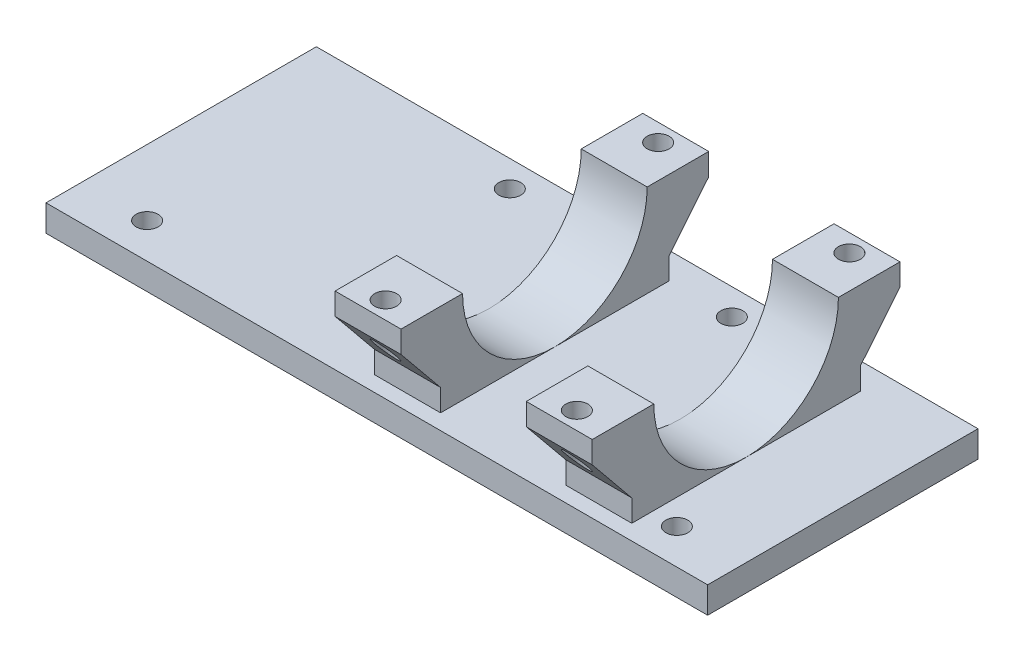
ISO-10303-21;
HEADER;
FILE_DESCRIPTION(('STEP AP214'),'2;1');
FILE_NAME('part.step','',(''),(''),'','','');
FILE_SCHEMA(('AUTOMOTIVE_DESIGN { 1 0 10303 214 1 1 1 1 }'));
ENDSEC;
DATA;
#1=APPLICATION_CONTEXT('core data for automotive mechanical design processes');
#2=APPLICATION_PROTOCOL_DEFINITION('international standard','automotive_design',2000,#1);
#3=PRODUCT_CONTEXT('',#1,'mechanical');
#4=PRODUCT('Part','Part','',(#3));
#5=PRODUCT_RELATED_PRODUCT_CATEGORY('part','',(#4));
#6=PRODUCT_DEFINITION_FORMATION('','',#4);
#7=PRODUCT_DEFINITION_CONTEXT('part definition',#1,'design');
#8=PRODUCT_DEFINITION('design','',#6,#7);
#9=PRODUCT_DEFINITION_SHAPE('','',#8);
#10=(LENGTH_UNIT() NAMED_UNIT(*) SI_UNIT(.MILLI.,.METRE.));
#11=(NAMED_UNIT(*) PLANE_ANGLE_UNIT() SI_UNIT($,.RADIAN.));
#12=(NAMED_UNIT(*) SI_UNIT($,.STERADIAN.) SOLID_ANGLE_UNIT());
#13=UNCERTAINTY_MEASURE_WITH_UNIT(LENGTH_MEASURE(1.E-05),#10,'distance_accuracy_value','');
#14=(GEOMETRIC_REPRESENTATION_CONTEXT(3) GLOBAL_UNCERTAINTY_ASSIGNED_CONTEXT((#13)) GLOBAL_UNIT_ASSIGNED_CONTEXT((#10,
#11,#12)) REPRESENTATION_CONTEXT('',''));
#15=CARTESIAN_POINT('',(0.,0.,0.));
#16=DIRECTION('',(0.,0.,1.));
#17=DIRECTION('',(1.,0.,0.));
#18=AXIS2_PLACEMENT_3D('',#15,#16,#17);
#19=CARTESIAN_POINT('',(36.5,6.,-26.));
#20=DIRECTION('',(0.,0.,-1.));
#21=DIRECTION('',(-1.,0.,0.));
#22=AXIS2_PLACEMENT_3D('',#19,#20,#21);
#23=PLANE('',#22);
#24=DIRECTION('',(1.,0.,0.));
#25=VECTOR('',#24,1.);
#26=CARTESIAN_POINT('',(72.25,6.,-26.));
#27=LINE('',#26,#25);
#28=CARTESIAN_POINT('',(-7.00000000000005,6.,-26.));
#29=VERTEX_POINT('',#28);
#30=CARTESIAN_POINT('',(7.99999999999995,6.,-26.));
#31=VERTEX_POINT('',#30);
#32=EDGE_CURVE('E249',#29,#31,#27,.T.);
#33=ORIENTED_EDGE('',*,*,#32,.F.);
#34=DIRECTION('',(0.,-1.,0.));
#35=VECTOR('',#34,1.);
#36=CARTESIAN_POINT('',(-7.00000000000004,6.,-26.));
#37=LINE('',#36,#35);
#38=CARTESIAN_POINT('',(-7.00000000000004,11.,-26.));
#39=VERTEX_POINT('',#38);
#40=EDGE_CURVE('E455',#39,#29,#37,.T.);
#41=ORIENTED_EDGE('',*,*,#40,.F.);
#42=DIRECTION('',(-1.,0.,0.));
#43=VECTOR('',#42,1.);
#44=CARTESIAN_POINT('',(7.99999999999996,11.,-26.));
#45=LINE('',#44,#43);
#46=CARTESIAN_POINT('',(7.99999999999995,11.,-26.));
#47=VERTEX_POINT('',#46);
#48=EDGE_CURVE('E64',#47,#39,#45,.T.);
#49=ORIENTED_EDGE('',*,*,#48,.F.);
#50=DIRECTION('',(0.,-1.,0.));
#51=VECTOR('',#50,1.);
#52=CARTESIAN_POINT('',(7.99999999999995,6.,-26.));
#53=LINE('',#52,#51);
#54=EDGE_CURVE('E451',#47,#31,#53,.T.);
#55=ORIENTED_EDGE('',*,*,#54,.T.);
#56=EDGE_LOOP('',(#33,#41,#49,#55));
#57=FACE_BOUND('',#56,.T.);
#58=ADVANCED_FACE('F44',(#57),#23,.T.);
#59=CARTESIAN_POINT('',(36.5,6.,-26.));
#60=VERTEX_POINT('',#59);
#61=CARTESIAN_POINT('',(51.5,6.,-26.));
#62=VERTEX_POINT('',#61);
#63=EDGE_CURVE('E252',#60,#62,#27,.T.);
#64=ORIENTED_EDGE('',*,*,#63,.F.);
#65=DIRECTION('',(0.,1.,0.));
#66=VECTOR('',#65,1.);
#67=CARTESIAN_POINT('',(36.5,6.,-26.));
#68=LINE('',#67,#66);
#69=CARTESIAN_POINT('',(36.5,11.,-26.));
#70=VERTEX_POINT('',#69);
#71=EDGE_CURVE('E487',#60,#70,#68,.T.);
#72=ORIENTED_EDGE('',*,*,#71,.T.);
#73=DIRECTION('',(1.,0.,0.));
#74=VECTOR('',#73,1.);
#75=CARTESIAN_POINT('',(36.5,11.,-26.));
#76=LINE('',#75,#74);
#77=CARTESIAN_POINT('',(51.5,11.,-26.));
#78=VERTEX_POINT('',#77);
#79=EDGE_CURVE('E316',#70,#78,#76,.T.);
#80=ORIENTED_EDGE('',*,*,#79,.T.);
#81=DIRECTION('',(0.,1.,0.));
#82=VECTOR('',#81,1.);
#83=CARTESIAN_POINT('',(51.5,6.,-26.));
#84=LINE('',#83,#82);
#85=EDGE_CURVE('E505',#62,#78,#84,.T.);
#86=ORIENTED_EDGE('',*,*,#85,.F.);
#87=EDGE_LOOP('',(#64,#72,#80,#86));
#88=FACE_BOUND('',#87,.T.);
#89=ADVANCED_FACE('F543',(#88),#23,.T.);
#90=CARTESIAN_POINT('',(36.5,6.,26.));
#91=DIRECTION('',(0.,0.,-1.));
#92=DIRECTION('',(-1.,0.,0.));
#93=AXIS2_PLACEMENT_3D('',#90,#91,#92);
#94=PLANE('',#93);
#95=DIRECTION('',(1.,0.,0.));
#96=VECTOR('',#95,1.);
#97=CARTESIAN_POINT('',(36.5,11.,26.));
#98=LINE('',#97,#96);
#99=CARTESIAN_POINT('',(36.5,11.,26.));
#100=VERTEX_POINT('',#99);
#101=CARTESIAN_POINT('',(51.5,11.,26.));
#102=VERTEX_POINT('',#101);
#103=EDGE_CURVE('E382',#100,#102,#98,.T.);
#104=ORIENTED_EDGE('',*,*,#103,.F.);
#105=DIRECTION('',(0.,1.,0.));
#106=VECTOR('',#105,1.);
#107=CARTESIAN_POINT('',(36.5,6.,26.));
#108=LINE('',#107,#106);
#109=CARTESIAN_POINT('',(36.5,6.,26.));
#110=VERTEX_POINT('',#109);
#111=EDGE_CURVE('E484',#110,#100,#108,.T.);
#112=ORIENTED_EDGE('',*,*,#111,.F.);
#113=DIRECTION('',(1.,0.,0.));
#114=VECTOR('',#113,1.);
#115=CARTESIAN_POINT('',(36.5,6.,26.));
#116=LINE('',#115,#114);
#117=CARTESIAN_POINT('',(51.5,6.,26.));
#118=VERTEX_POINT('',#117);
#119=EDGE_CURVE('E492',#110,#118,#116,.T.);
#120=ORIENTED_EDGE('',*,*,#119,.T.);
#121=DIRECTION('',(0.,1.,0.));
#122=VECTOR('',#121,1.);
#123=CARTESIAN_POINT('',(51.5,6.,26.));
#124=LINE('',#123,#122);
#125=EDGE_CURVE('E497',#118,#102,#124,.T.);
#126=ORIENTED_EDGE('',*,*,#125,.T.);
#127=EDGE_LOOP('',(#104,#112,#120,#126));
#128=FACE_BOUND('',#127,.T.);
#129=ADVANCED_FACE('F548',(#128),#94,.F.);
#130=CARTESIAN_POINT('',(36.5,27.,0.));
#131=DIRECTION('',(1.,0.,0.));
#132=DIRECTION('',(0.,0.,-1.));
#133=AXIS2_PLACEMENT_3D('',#130,#131,#132);
#134=PLANE('',#133);
#135=ORIENTED_EDGE('',*,*,#111,.T.);
#136=DIRECTION('',(0.,-0.773957299203321,-0.633237790257262));
#137=VECTOR('',#136,1.);
#138=CARTESIAN_POINT('',(36.5,22.,35.));
#139=LINE('',#138,#137);
#140=CARTESIAN_POINT('',(36.5,22.,35.));
#141=VERTEX_POINT('',#140);
#142=EDGE_CURVE('E368',#141,#100,#139,.T.);
#143=ORIENTED_EDGE('',*,*,#142,.F.);
#144=DIRECTION('',(0.,-1.,0.));
#145=VECTOR('',#144,1.);
#146=CARTESIAN_POINT('',(36.5,27.,35.));
#147=LINE('',#146,#145);
#148=CARTESIAN_POINT('',(36.5,27.,35.));
#149=VERTEX_POINT('',#148);
#150=EDGE_CURVE('E361',#149,#141,#147,.T.);
#151=ORIENTED_EDGE('',*,*,#150,.F.);
#152=DIRECTION('',(0.,0.,-1.));
#153=VECTOR('',#152,1.);
#154=CARTESIAN_POINT('',(36.5,27.,0.));
#155=LINE('',#154,#153);
#156=CARTESIAN_POINT('',(36.5,27.,21.));
#157=VERTEX_POINT('',#156);
#158=EDGE_CURVE('E392',#149,#157,#155,.T.);
#159=ORIENTED_EDGE('',*,*,#158,.T.);
#160=CARTESIAN_POINT('',(36.5,27.,0.));
#161=DIRECTION('',(1.,0.,0.));
#162=DIRECTION('',(0.,0.,-1.));
#163=AXIS2_PLACEMENT_3D('',#160,#161,#162);
#164=CIRCLE('',#163,21.);
#165=CARTESIAN_POINT('',(36.5,6.00000000000001,0.));
#166=VERTEX_POINT('',#165);
#167=EDGE_CURVE('E446',#157,#166,#164,.T.);
#168=ORIENTED_EDGE('',*,*,#167,.T.);
#169=DIRECTION('',(0.,0.,1.));
#170=VECTOR('',#169,1.);
#171=CARTESIAN_POINT('',(36.5,6.,-26.));
#172=LINE('',#171,#170);
#173=EDGE_CURVE('E488',#166,#110,#172,.T.);
#174=ORIENTED_EDGE('',*,*,#173,.T.);
#175=EDGE_LOOP('',(#135,#143,#151,#159,#168,#174));
#176=FACE_BOUND('',#175,.T.);
#177=ADVANCED_FACE('F558',(#176),#134,.F.);
#178=CARTESIAN_POINT('',(51.5,27.,0.));
#179=DIRECTION('',(1.,0.,0.));
#180=DIRECTION('',(0.,0.,-1.));
#181=AXIS2_PLACEMENT_3D('',#178,#179,#180);
#182=PLANE('',#181);
#183=DIRECTION('',(0.,0.,-1.));
#184=VECTOR('',#183,1.);
#185=CARTESIAN_POINT('',(51.5,27.,0.));
#186=LINE('',#185,#184);
#187=CARTESIAN_POINT('',(51.5,27.,35.));
#188=VERTEX_POINT('',#187);
#189=CARTESIAN_POINT('',(51.5,27.,21.));
#190=VERTEX_POINT('',#189);
#191=EDGE_CURVE('E383',#188,#190,#186,.T.);
#192=ORIENTED_EDGE('',*,*,#191,.F.);
#193=DIRECTION('',(0.,-1.,0.));
#194=VECTOR('',#193,1.);
#195=CARTESIAN_POINT('',(51.5,27.,35.));
#196=LINE('',#195,#194);
#197=CARTESIAN_POINT('',(51.5,22.,35.));
#198=VERTEX_POINT('',#197);
#199=EDGE_CURVE('E373',#188,#198,#196,.T.);
#200=ORIENTED_EDGE('',*,*,#199,.T.);
#201=DIRECTION('',(0.,-0.773957299203321,-0.633237790257262));
#202=VECTOR('',#201,1.);
#203=CARTESIAN_POINT('',(51.5,22.,35.));
#204=LINE('',#203,#202);
#205=EDGE_CURVE('E367',#198,#102,#204,.T.);
#206=ORIENTED_EDGE('',*,*,#205,.T.);
#207=ORIENTED_EDGE('',*,*,#125,.F.);
#208=DIRECTION('',(0.,0.,1.));
#209=VECTOR('',#208,1.);
#210=CARTESIAN_POINT('',(51.5,6.,-26.));
#211=LINE('',#210,#209);
#212=CARTESIAN_POINT('',(51.5,6.00000000000001,0.));
#213=VERTEX_POINT('',#212);
#214=EDGE_CURVE('E479',#213,#118,#211,.T.);
#215=ORIENTED_EDGE('',*,*,#214,.F.);
#216=CARTESIAN_POINT('',(51.5,27.,0.));
#217=DIRECTION('',(1.,0.,0.));
#218=DIRECTION('',(0.,0.,-1.));
#219=AXIS2_PLACEMENT_3D('',#216,#217,#218);
#220=CIRCLE('',#219,21.);
#221=EDGE_CURVE('E433',#190,#213,#220,.T.);
#222=ORIENTED_EDGE('',*,*,#221,.F.);
#223=EDGE_LOOP('',(#192,#200,#206,#207,#215,#222));
#224=FACE_BOUND('',#223,.T.);
#225=ADVANCED_FACE('F634',(#224),#182,.T.);
#226=CARTESIAN_POINT('',(-7.00000000000004,27.,0.));
#227=DIRECTION('',(-1.,0.,0.));
#228=DIRECTION('',(0.,0.,1.));
#229=AXIS2_PLACEMENT_3D('',#226,#227,#228);
#230=PLANE('',#229);
#231=DIRECTION('',(0.,0.,1.));
#232=VECTOR('',#231,1.);
#233=CARTESIAN_POINT('',(-7.00000000000004,27.,0.));
#234=LINE('',#233,#232);
#235=CARTESIAN_POINT('',(-7.00000000000004,27.,-35.));
#236=VERTEX_POINT('',#235);
#237=CARTESIAN_POINT('',(-7.00000000000005,27.,-21.));
#238=VERTEX_POINT('',#237);
#239=EDGE_CURVE('E415',#236,#238,#234,.T.);
#240=ORIENTED_EDGE('',*,*,#239,.F.);
#241=DIRECTION('',(0.,-1.,0.));
#242=VECTOR('',#241,1.);
#243=CARTESIAN_POINT('',(-7.00000000000004,27.,-35.));
#244=LINE('',#243,#242);
#245=CARTESIAN_POINT('',(-7.00000000000004,22.,-35.));
#246=VERTEX_POINT('',#245);
#247=EDGE_CURVE('E286',#236,#246,#244,.T.);
#248=ORIENTED_EDGE('',*,*,#247,.T.);
#249=DIRECTION('',(0.,-0.773957299203321,0.633237790257262));
#250=VECTOR('',#249,1.);
#251=CARTESIAN_POINT('',(-7.00000000000004,22.,-35.));
#252=LINE('',#251,#250);
#253=EDGE_CURVE('E281',#246,#39,#252,.T.);
#254=ORIENTED_EDGE('',*,*,#253,.T.);
#255=ORIENTED_EDGE('',*,*,#40,.T.);
#256=DIRECTION('',(0.,0.,1.));
#257=VECTOR('',#256,1.);
#258=CARTESIAN_POINT('',(-7.00000000000004,6.,-26.));
#259=LINE('',#258,#257);
#260=CARTESIAN_POINT('',(-7.00000000000005,6.00000000000001,0.));
#261=VERTEX_POINT('',#260);
#262=EDGE_CURVE('E456',#29,#261,#259,.T.);
#263=ORIENTED_EDGE('',*,*,#262,.T.);
#264=CARTESIAN_POINT('',(-7.00000000000005,27.,0.));
#265=DIRECTION('',(-1.,0.,0.));
#266=DIRECTION('',(0.,0.,1.));
#267=AXIS2_PLACEMENT_3D('',#264,#265,#266);
#268=CIRCLE('',#267,21.);
#269=EDGE_CURVE('E444',#238,#261,#268,.T.);
#270=ORIENTED_EDGE('',*,*,#269,.F.);
#271=EDGE_LOOP('',(#240,#248,#254,#255,#263,#270));
#272=FACE_BOUND('',#271,.T.);
#273=ADVANCED_FACE('F625',(#272),#230,.T.);
#274=CARTESIAN_POINT('',(7.99999999999995,27.,0.));
#275=DIRECTION('',(-1.,0.,0.));
#276=DIRECTION('',(0.,0.,1.));
#277=AXIS2_PLACEMENT_3D('',#274,#275,#276);
#278=PLANE('',#277);
#279=ORIENTED_EDGE('',*,*,#54,.F.);
#280=DIRECTION('',(0.,-0.773957299203321,0.633237790257262));
#281=VECTOR('',#280,1.);
#282=CARTESIAN_POINT('',(7.99999999999996,22.,-35.));
#283=LINE('',#282,#281);
#284=CARTESIAN_POINT('',(7.99999999999996,22.,-35.));
#285=VERTEX_POINT('',#284);
#286=EDGE_CURVE('E284',#285,#47,#283,.T.);
#287=ORIENTED_EDGE('',*,*,#286,.F.);
#288=DIRECTION('',(0.,-1.,0.));
#289=VECTOR('',#288,1.);
#290=CARTESIAN_POINT('',(7.99999999999996,27.,-35.));
#291=LINE('',#290,#289);
#292=CARTESIAN_POINT('',(7.99999999999996,27.,-35.));
#293=VERTEX_POINT('',#292);
#294=EDGE_CURVE('E278',#293,#285,#291,.T.);
#295=ORIENTED_EDGE('',*,*,#294,.F.);
#296=DIRECTION('',(0.,0.,1.));
#297=VECTOR('',#296,1.);
#298=CARTESIAN_POINT('',(7.99999999999995,27.,0.));
#299=LINE('',#298,#297);
#300=CARTESIAN_POINT('',(7.99999999999995,27.,-21.));
#301=VERTEX_POINT('',#300);
#302=EDGE_CURVE('E406',#293,#301,#299,.T.);
#303=ORIENTED_EDGE('',*,*,#302,.T.);
#304=CARTESIAN_POINT('',(7.99999999999995,27.,0.));
#305=DIRECTION('',(-1.,0.,0.));
#306=DIRECTION('',(0.,0.,1.));
#307=AXIS2_PLACEMENT_3D('',#304,#305,#306);
#308=CIRCLE('',#307,21.);
#309=CARTESIAN_POINT('',(7.99999999999995,6.00000000000001,0.));
#310=VERTEX_POINT('',#309);
#311=EDGE_CURVE('E438',#301,#310,#308,.T.);
#312=ORIENTED_EDGE('',*,*,#311,.T.);
#313=DIRECTION('',(0.,0.,1.));
#314=VECTOR('',#313,1.);
#315=CARTESIAN_POINT('',(7.99999999999995,6.,-26.));
#316=LINE('',#315,#314);
#317=EDGE_CURVE('E469',#31,#310,#316,.T.);
#318=ORIENTED_EDGE('',*,*,#317,.F.);
#319=EDGE_LOOP('',(#279,#287,#295,#303,#312,#318));
#320=FACE_BOUND('',#319,.T.);
#321=ADVANCED_FACE('F567',(#320),#278,.F.);
#322=CARTESIAN_POINT('',(0.,0.,29.5));
#323=DIRECTION('',(0.,0.,1.));
#324=DIRECTION('',(1.,0.,0.));
#325=AXIS2_PLACEMENT_3D('',#322,#323,#324);
#326=PLANE('',#325);
#327=DIRECTION('',(1.,0.,0.));
#328=VECTOR('',#327,1.);
#329=CARTESIAN_POINT('',(-74.5,0.,29.5));
#330=LINE('',#329,#328);
#331=CARTESIAN_POINT('',(-78.25,0.,29.5));
#332=VERTEX_POINT('',#331);
#333=CARTESIAN_POINT('',(72.25,0.,29.5));
#334=VERTEX_POINT('',#333);
#335=EDGE_CURVE('E428',#332,#334,#330,.T.);
#336=ORIENTED_EDGE('',*,*,#335,.T.);
#337=DIRECTION('',(0.,1.,0.));
#338=VECTOR('',#337,1.);
#339=CARTESIAN_POINT('',(72.25,0.,29.5));
#340=LINE('',#339,#338);
#341=CARTESIAN_POINT('',(72.25,6.,29.5));
#342=VERTEX_POINT('',#341);
#343=EDGE_CURVE('E227',#334,#342,#340,.T.);
#344=ORIENTED_EDGE('',*,*,#343,.T.);
#345=DIRECTION('',(-1.,0.,0.));
#346=VECTOR('',#345,1.);
#347=CARTESIAN_POINT('',(74.5,6.,29.5));
#348=LINE('',#347,#346);
#349=CARTESIAN_POINT('',(-78.25,6.,29.5));
#350=VERTEX_POINT('',#349);
#351=EDGE_CURVE('E435',#342,#350,#348,.T.);
#352=ORIENTED_EDGE('',*,*,#351,.T.);
#353=DIRECTION('',(0.,1.,0.));
#354=VECTOR('',#353,1.);
#355=CARTESIAN_POINT('',(-78.25,0.,29.5));
#356=LINE('',#355,#354);
#357=EDGE_CURVE('E418',#332,#350,#356,.T.);
#358=ORIENTED_EDGE('',*,*,#357,.F.);
#359=EDGE_LOOP('',(#336,#344,#352,#358));
#360=FACE_BOUND('',#359,.T.);
#361=ADVANCED_FACE('F559',(#360),#326,.T.);
#362=CARTESIAN_POINT('',(0.,6.,0.));
#363=DIRECTION('',(0.,1.,0.));
#364=DIRECTION('',(0.,0.,1.));
#365=AXIS2_PLACEMENT_3D('',#362,#363,#364);
#366=PLANE('',#365);
#367=CARTESIAN_POINT('',(-28.25,6.,-26.));
#368=DIRECTION('',(0.,-1.,0.));
#369=DIRECTION('',(0.,0.,1.));
#370=AXIS2_PLACEMENT_3D('',#367,#368,#369);
#371=CIRCLE('',#370,2.5);
#372=CARTESIAN_POINT('',(-28.25,6.,-23.5));
#373=VERTEX_POINT('',#372);
#374=EDGE_CURVE('E574',#373,#373,#371,.T.);
#375=ORIENTED_EDGE('',*,*,#374,.T.);
#376=EDGE_LOOP('',(#375));
#377=FACE_BOUND('',#376,.T.);
#378=CARTESIAN_POINT('',(22.25,6.,-26.));
#379=DIRECTION('',(0.,1.,0.));
#380=DIRECTION('',(0.,0.,1.));
#381=AXIS2_PLACEMENT_3D('',#378,#379,#380);
#382=CIRCLE('',#381,2.5);
#383=CARTESIAN_POINT('',(22.25,6.,-23.5));
#384=VERTEX_POINT('',#383);
#385=EDGE_CURVE('E578',#384,#384,#382,.T.);
#386=ORIENTED_EDGE('',*,*,#385,.F.);
#387=EDGE_LOOP('',(#386));
#388=FACE_BOUND('',#387,.T.);
#389=CARTESIAN_POINT('',(57.25,6.,21.5));
#390=DIRECTION('',(0.,-1.,0.));
#391=DIRECTION('',(0.,0.,1.));
#392=AXIS2_PLACEMENT_3D('',#389,#390,#391);
#393=CIRCLE('',#392,2.50000000000001);
#394=CARTESIAN_POINT('',(57.25,6.,24.));
#395=VERTEX_POINT('',#394);
#396=EDGE_CURVE('E257',#395,#395,#393,.T.);
#397=ORIENTED_EDGE('',*,*,#396,.T.);
#398=EDGE_LOOP('',(#397));
#399=FACE_BOUND('',#398,.T.);
#400=ORIENTED_EDGE('',*,*,#262,.F.);
#401=ORIENTED_EDGE('',*,*,#32,.T.);
#402=ORIENTED_EDGE('',*,*,#317,.T.);
#403=CARTESIAN_POINT('',(7.99999999999995,6.,26.));
#404=VERTEX_POINT('',#403);
#405=EDGE_CURVE('E467',#310,#404,#316,.T.);
#406=ORIENTED_EDGE('',*,*,#405,.T.);
#407=DIRECTION('',(1.,0.,0.));
#408=VECTOR('',#407,1.);
#409=CARTESIAN_POINT('',(-7.00000000000004,6.,26.));
#410=LINE('',#409,#408);
#411=CARTESIAN_POINT('',(-7.00000000000004,6.,26.));
#412=VERTEX_POINT('',#411);
#413=EDGE_CURVE('E466',#412,#404,#410,.T.);
#414=ORIENTED_EDGE('',*,*,#413,.F.);
#415=EDGE_CURVE('E457',#261,#412,#259,.T.);
#416=ORIENTED_EDGE('',*,*,#415,.F.);
#417=EDGE_LOOP('',(#400,#401,#402,#406,#414,#416));
#418=FACE_BOUND('',#417,.T.);
#419=EDGE_CURVE('E483',#60,#166,#172,.T.);
#420=ORIENTED_EDGE('',*,*,#419,.F.);
#421=ORIENTED_EDGE('',*,*,#63,.T.);
#422=EDGE_CURVE('E494',#62,#213,#211,.T.);
#423=ORIENTED_EDGE('',*,*,#422,.T.);
#424=ORIENTED_EDGE('',*,*,#214,.T.);
#425=ORIENTED_EDGE('',*,*,#119,.F.);
#426=ORIENTED_EDGE('',*,*,#173,.F.);
#427=EDGE_LOOP('',(#420,#421,#423,#424,#425,#426));
#428=FACE_BOUND('',#427,.T.);
#429=CARTESIAN_POINT('',(-63.25,6.,21.5));
#430=DIRECTION('',(0.,1.,0.));
#431=DIRECTION('',(0.,0.,1.));
#432=AXIS2_PLACEMENT_3D('',#429,#430,#431);
#433=CIRCLE('',#432,2.50000000000001);
#434=CARTESIAN_POINT('',(-63.25,6.,24.));
#435=VERTEX_POINT('',#434);
#436=EDGE_CURVE('E261',#435,#435,#433,.T.);
#437=ORIENTED_EDGE('',*,*,#436,.F.);
#438=EDGE_LOOP('',(#437));
#439=FACE_BOUND('',#438,.T.);
#440=DIRECTION('',(1.,0.,0.));
#441=VECTOR('',#440,1.);
#442=CARTESIAN_POINT('',(72.25,6.,-32.));
#443=LINE('',#442,#441);
#444=CARTESIAN_POINT('',(-78.25,6.,-32.));
#445=VERTEX_POINT('',#444);
#446=CARTESIAN_POINT('',(72.25,6.,-32.));
#447=VERTEX_POINT('',#446);
#448=EDGE_CURVE('E247',#445,#447,#443,.T.);
#449=ORIENTED_EDGE('',*,*,#448,.F.);
#450=DIRECTION('',(0.,0.,-1.));
#451=VECTOR('',#450,1.);
#452=CARTESIAN_POINT('',(-78.25,6.,29.5));
#453=LINE('',#452,#451);
#454=EDGE_CURVE('E425',#350,#445,#453,.T.);
#455=ORIENTED_EDGE('',*,*,#454,.F.);
#456=ORIENTED_EDGE('',*,*,#351,.F.);
#457=DIRECTION('',(0.,0.,1.));
#458=VECTOR('',#457,1.);
#459=CARTESIAN_POINT('',(72.25,6.,-26.5));
#460=LINE('',#459,#458);
#461=EDGE_CURVE('E234',#447,#342,#460,.T.);
#462=ORIENTED_EDGE('',*,*,#461,.F.);
#463=EDGE_LOOP('',(#449,#455,#456,#462));
#464=FACE_BOUND('',#463,.T.);
#465=ADVANCED_FACE('F556',(#377,#388,#399,#418,#428,#439,#464),#366,.T.);
#466=CARTESIAN_POINT('',(0.,0.,0.));
#467=DIRECTION('',(0.,1.,0.));
#468=DIRECTION('',(0.,0.,1.));
#469=AXIS2_PLACEMENT_3D('',#466,#467,#468);
#470=PLANE('',#469);
#471=CARTESIAN_POINT('',(-28.25,0.,-26.));
#472=DIRECTION('',(0.,-1.,0.));
#473=DIRECTION('',(0.,0.,1.));
#474=AXIS2_PLACEMENT_3D('',#471,#472,#473);
#475=CIRCLE('',#474,2.5);
#476=CARTESIAN_POINT('',(-28.25,0.,-23.5));
#477=VERTEX_POINT('',#476);
#478=EDGE_CURVE('E992',#477,#477,#475,.T.);
#479=ORIENTED_EDGE('',*,*,#478,.F.);
#480=EDGE_LOOP('',(#479));
#481=FACE_BOUND('',#480,.T.);
#482=CARTESIAN_POINT('',(22.25,0.,-26.));
#483=DIRECTION('',(0.,1.,0.));
#484=DIRECTION('',(0.,0.,1.));
#485=AXIS2_PLACEMENT_3D('',#482,#483,#484);
#486=CIRCLE('',#485,2.5);
#487=CARTESIAN_POINT('',(22.25,0.,-23.5));
#488=VERTEX_POINT('',#487);
#489=EDGE_CURVE('E999',#488,#488,#486,.T.);
#490=ORIENTED_EDGE('',*,*,#489,.T.);
#491=EDGE_LOOP('',(#490));
#492=FACE_BOUND('',#491,.T.);
#493=CARTESIAN_POINT('',(57.25,0.,21.5));
#494=DIRECTION('',(0.,-1.,0.));
#495=DIRECTION('',(0.,0.,1.));
#496=AXIS2_PLACEMENT_3D('',#493,#494,#495);
#497=CIRCLE('',#496,2.50000000000001);
#498=CARTESIAN_POINT('',(57.25,0.,24.));
#499=VERTEX_POINT('',#498);
#500=EDGE_CURVE('E270',#499,#499,#497,.T.);
#501=ORIENTED_EDGE('',*,*,#500,.F.);
#502=EDGE_LOOP('',(#501));
#503=FACE_BOUND('',#502,.T.);
#504=CARTESIAN_POINT('',(-63.25,0.,21.5));
#505=DIRECTION('',(0.,1.,0.));
#506=DIRECTION('',(0.,0.,1.));
#507=AXIS2_PLACEMENT_3D('',#504,#505,#506);
#508=CIRCLE('',#507,2.50000000000001);
#509=CARTESIAN_POINT('',(-63.25,0.,24.));
#510=VERTEX_POINT('',#509);
#511=EDGE_CURVE('E268',#510,#510,#508,.T.);
#512=ORIENTED_EDGE('',*,*,#511,.T.);
#513=EDGE_LOOP('',(#512));
#514=FACE_BOUND('',#513,.T.);
#515=DIRECTION('',(0.,0.,1.));
#516=VECTOR('',#515,1.);
#517=CARTESIAN_POINT('',(-78.25,0.,-26.5));
#518=LINE('',#517,#516);
#519=CARTESIAN_POINT('',(-78.25,0.,-32.));
#520=VERTEX_POINT('',#519);
#521=EDGE_CURVE('E239',#520,#332,#518,.T.);
#522=ORIENTED_EDGE('',*,*,#521,.F.);
#523=DIRECTION('',(-1.,0.,0.));
#524=VECTOR('',#523,1.);
#525=CARTESIAN_POINT('',(72.25,0.,-32.));
#526=LINE('',#525,#524);
#527=CARTESIAN_POINT('',(72.25,0.,-32.));
#528=VERTEX_POINT('',#527);
#529=EDGE_CURVE('E240',#528,#520,#526,.T.);
#530=ORIENTED_EDGE('',*,*,#529,.F.);
#531=DIRECTION('',(0.,0.,1.));
#532=VECTOR('',#531,1.);
#533=CARTESIAN_POINT('',(72.25,0.,-26.5));
#534=LINE('',#533,#532);
#535=EDGE_CURVE('E222',#528,#334,#534,.T.);
#536=ORIENTED_EDGE('',*,*,#535,.T.);
#537=ORIENTED_EDGE('',*,*,#335,.F.);
#538=EDGE_LOOP('',(#522,#530,#536,#537));
#539=FACE_BOUND('',#538,.T.);
#540=ADVANCED_FACE('F50',(#481,#492,#503,#514,#539),#470,.F.);
#541=CARTESIAN_POINT('',(36.5,27.,-21.));
#542=VERTEX_POINT('',#541);
#543=EDGE_CURVE('E441',#166,#542,#164,.T.);
#544=ORIENTED_EDGE('',*,*,#543,.T.);
#545=CARTESIAN_POINT('',(36.5,27.,-35.));
#546=VERTEX_POINT('',#545);
#547=EDGE_CURVE('E398',#542,#546,#155,.T.);
#548=ORIENTED_EDGE('',*,*,#547,.T.);
#549=DIRECTION('',(0.,-1.,0.));
#550=VECTOR('',#549,1.);
#551=CARTESIAN_POINT('',(36.5,27.,-35.));
#552=LINE('',#551,#550);
#553=CARTESIAN_POINT('',(36.5,22.,-35.));
#554=VERTEX_POINT('',#553);
#555=EDGE_CURVE('E315',#546,#554,#552,.T.);
#556=ORIENTED_EDGE('',*,*,#555,.T.);
#557=DIRECTION('',(0.,-0.773957299203321,0.633237790257262));
#558=VECTOR('',#557,1.);
#559=CARTESIAN_POINT('',(36.5,22.,-35.));
#560=LINE('',#559,#558);
#561=EDGE_CURVE('E309',#554,#70,#560,.T.);
#562=ORIENTED_EDGE('',*,*,#561,.T.);
#563=ORIENTED_EDGE('',*,*,#71,.F.);
#564=ORIENTED_EDGE('',*,*,#419,.T.);
#565=EDGE_LOOP('',(#544,#548,#556,#562,#563,#564));
#566=FACE_BOUND('',#565,.T.);
#567=ADVANCED_FACE('F566',(#566),#134,.F.);
#568=CARTESIAN_POINT('',(51.5,27.,-21.));
#569=VERTEX_POINT('',#568);
#570=CARTESIAN_POINT('',(51.5,27.,-35.));
#571=VERTEX_POINT('',#570);
#572=EDGE_CURVE('E394',#569,#571,#186,.T.);
#573=ORIENTED_EDGE('',*,*,#572,.F.);
#574=EDGE_CURVE('E437',#213,#569,#220,.T.);
#575=ORIENTED_EDGE('',*,*,#574,.F.);
#576=ORIENTED_EDGE('',*,*,#422,.F.);
#577=ORIENTED_EDGE('',*,*,#85,.T.);
#578=DIRECTION('',(0.,-0.773957299203321,0.633237790257262));
#579=VECTOR('',#578,1.);
#580=CARTESIAN_POINT('',(51.5,22.,-35.));
#581=LINE('',#580,#579);
#582=CARTESIAN_POINT('',(51.5,22.,-35.));
#583=VERTEX_POINT('',#582);
#584=EDGE_CURVE('E71',#583,#78,#581,.T.);
#585=ORIENTED_EDGE('',*,*,#584,.F.);
#586=DIRECTION('',(0.,-1.,0.));
#587=VECTOR('',#586,1.);
#588=CARTESIAN_POINT('',(51.5,27.,-35.));
#589=LINE('',#588,#587);
#590=EDGE_CURVE('E314',#571,#583,#589,.T.);
#591=ORIENTED_EDGE('',*,*,#590,.F.);
#592=EDGE_LOOP('',(#573,#575,#576,#577,#585,#591));
#593=FACE_BOUND('',#592,.T.);
#594=ADVANCED_FACE('F553',(#593),#182,.T.);
#595=CARTESIAN_POINT('',(-7.00000000000004,6.,26.));
#596=DIRECTION('',(0.,0.,-1.));
#597=DIRECTION('',(-1.,0.,0.));
#598=AXIS2_PLACEMENT_3D('',#595,#596,#597);
#599=PLANE('',#598);
#600=DIRECTION('',(0.,1.,0.));
#601=VECTOR('',#600,1.);
#602=CARTESIAN_POINT('',(7.99999999999995,6.,26.));
#603=LINE('',#602,#601);
#604=CARTESIAN_POINT('',(7.99999999999996,11.,26.));
#605=VERTEX_POINT('',#604);
#606=EDGE_CURVE('E460',#404,#605,#603,.T.);
#607=ORIENTED_EDGE('',*,*,#606,.T.);
#608=DIRECTION('',(-1.,0.,0.));
#609=VECTOR('',#608,1.);
#610=CARTESIAN_POINT('',(7.99999999999996,11.,26.));
#611=LINE('',#610,#609);
#612=CARTESIAN_POINT('',(-7.00000000000004,11.,26.));
#613=VERTEX_POINT('',#612);
#614=EDGE_CURVE('E345',#605,#613,#611,.T.);
#615=ORIENTED_EDGE('',*,*,#614,.T.);
#616=DIRECTION('',(0.,1.,0.));
#617=VECTOR('',#616,1.);
#618=CARTESIAN_POINT('',(-7.00000000000004,6.,26.));
#619=LINE('',#618,#617);
#620=EDGE_CURVE('E465',#412,#613,#619,.T.);
#621=ORIENTED_EDGE('',*,*,#620,.F.);
#622=ORIENTED_EDGE('',*,*,#413,.T.);
#623=EDGE_LOOP('',(#607,#615,#621,#622));
#624=FACE_BOUND('',#623,.T.);
#625=ADVANCED_FACE('F619',(#624),#599,.F.);
#626=CARTESIAN_POINT('',(-7.00000000000005,27.,21.));
#627=VERTEX_POINT('',#626);
#628=CARTESIAN_POINT('',(-7.00000000000004,27.,35.));
#629=VERTEX_POINT('',#628);
#630=EDGE_CURVE('E407',#627,#629,#234,.T.);
#631=ORIENTED_EDGE('',*,*,#630,.F.);
#632=EDGE_CURVE('E450',#261,#627,#268,.T.);
#633=ORIENTED_EDGE('',*,*,#632,.F.);
#634=ORIENTED_EDGE('',*,*,#415,.T.);
#635=ORIENTED_EDGE('',*,*,#620,.T.);
#636=DIRECTION('',(0.,-0.773957299203321,-0.633237790257262));
#637=VECTOR('',#636,1.);
#638=CARTESIAN_POINT('',(-7.00000000000004,22.,35.));
#639=LINE('',#638,#637);
#640=CARTESIAN_POINT('',(-7.00000000000004,22.,35.));
#641=VERTEX_POINT('',#640);
#642=EDGE_CURVE('E343',#641,#613,#639,.T.);
#643=ORIENTED_EDGE('',*,*,#642,.F.);
#644=DIRECTION('',(0.,-1.,0.));
#645=VECTOR('',#644,1.);
#646=CARTESIAN_POINT('',(-7.00000000000004,27.,35.));
#647=LINE('',#646,#645);
#648=EDGE_CURVE('E339',#629,#641,#647,.T.);
#649=ORIENTED_EDGE('',*,*,#648,.F.);
#650=EDGE_LOOP('',(#631,#633,#634,#635,#643,#649));
#651=FACE_BOUND('',#650,.T.);
#652=ADVANCED_FACE('F616',(#651),#230,.T.);
#653=CARTESIAN_POINT('',(7.99999999999995,27.,21.));
#654=VERTEX_POINT('',#653);
#655=EDGE_CURVE('E506',#310,#654,#308,.T.);
#656=ORIENTED_EDGE('',*,*,#655,.T.);
#657=CARTESIAN_POINT('',(7.99999999999996,27.,35.));
#658=VERTEX_POINT('',#657);
#659=EDGE_CURVE('E402',#654,#658,#299,.T.);
#660=ORIENTED_EDGE('',*,*,#659,.T.);
#661=DIRECTION('',(0.,-1.,0.));
#662=VECTOR('',#661,1.);
#663=CARTESIAN_POINT('',(7.99999999999996,27.,35.));
#664=LINE('',#663,#662);
#665=CARTESIAN_POINT('',(7.99999999999996,22.,35.));
#666=VERTEX_POINT('',#665);
#667=EDGE_CURVE('E336',#658,#666,#664,.T.);
#668=ORIENTED_EDGE('',*,*,#667,.T.);
#669=DIRECTION('',(0.,-0.773957299203321,-0.633237790257262));
#670=VECTOR('',#669,1.);
#671=CARTESIAN_POINT('',(7.99999999999996,22.,35.));
#672=LINE('',#671,#670);
#673=EDGE_CURVE('E334',#666,#605,#672,.T.);
#674=ORIENTED_EDGE('',*,*,#673,.T.);
#675=ORIENTED_EDGE('',*,*,#606,.F.);
#676=ORIENTED_EDGE('',*,*,#405,.F.);
#677=EDGE_LOOP('',(#656,#660,#668,#674,#675,#676));
#678=FACE_BOUND('',#677,.T.);
#679=ADVANCED_FACE('F617',(#678),#278,.F.);
#680=CARTESIAN_POINT('',(-74.5,27.,0.));
#681=DIRECTION('',(1.,0.,0.));
#682=DIRECTION('',(0.,0.,-1.));
#683=AXIS2_PLACEMENT_3D('',#680,#681,#682);
#684=CYLINDRICAL_SURFACE('',#683,21.);
#685=ORIENTED_EDGE('',*,*,#311,.F.);
#686=DIRECTION('',(1.,0.,0.));
#687=VECTOR('',#686,1.);
#688=CARTESIAN_POINT('',(-74.5,27.,-21.));
#689=LINE('',#688,#687);
#690=EDGE_CURVE('E413',#301,#238,#689,.F.);
#691=ORIENTED_EDGE('',*,*,#690,.T.);
#692=ORIENTED_EDGE('',*,*,#269,.T.);
#693=ORIENTED_EDGE('',*,*,#632,.T.);
#694=DIRECTION('',(1.,0.,0.));
#695=VECTOR('',#694,1.);
#696=CARTESIAN_POINT('',(-74.5,27.,21.));
#697=LINE('',#696,#695);
#698=EDGE_CURVE('E399',#627,#654,#697,.T.);
#699=ORIENTED_EDGE('',*,*,#698,.T.);
#700=ORIENTED_EDGE('',*,*,#655,.F.);
#701=EDGE_LOOP('',(#685,#691,#692,#693,#699,#700));
#702=FACE_BOUND('',#701,.T.);
#703=ADVANCED_FACE('F611',(#702),#684,.F.);
#704=ORIENTED_EDGE('',*,*,#574,.T.);
#705=DIRECTION('',(1.,0.,0.));
#706=VECTOR('',#705,1.);
#707=CARTESIAN_POINT('',(-74.5,27.,-21.));
#708=LINE('',#707,#706);
#709=EDGE_CURVE('E11',#569,#542,#708,.F.);
#710=ORIENTED_EDGE('',*,*,#709,.T.);
#711=ORIENTED_EDGE('',*,*,#543,.F.);
#712=ORIENTED_EDGE('',*,*,#167,.F.);
#713=DIRECTION('',(1.,0.,0.));
#714=VECTOR('',#713,1.);
#715=CARTESIAN_POINT('',(-74.5,27.,21.));
#716=LINE('',#715,#714);
#717=EDGE_CURVE('E54',#157,#190,#716,.T.);
#718=ORIENTED_EDGE('',*,*,#717,.T.);
#719=ORIENTED_EDGE('',*,*,#221,.T.);
#720=EDGE_LOOP('',(#704,#710,#711,#712,#718,#719));
#721=FACE_BOUND('',#720,.T.);
#722=ADVANCED_FACE('F606',(#721),#684,.F.);
#723=CARTESIAN_POINT('',(72.25,0.,-26.5));
#724=DIRECTION('',(-1.,0.,0.));
#725=DIRECTION('',(0.,0.,1.));
#726=AXIS2_PLACEMENT_3D('',#723,#724,#725);
#727=PLANE('',#726);
#728=ORIENTED_EDGE('',*,*,#535,.F.);
#729=DIRECTION('',(0.,-1.,0.));
#730=VECTOR('',#729,1.);
#731=CARTESIAN_POINT('',(72.25,6.,-32.));
#732=LINE('',#731,#730);
#733=EDGE_CURVE('E230',#447,#528,#732,.T.);
#734=ORIENTED_EDGE('',*,*,#733,.F.);
#735=ORIENTED_EDGE('',*,*,#461,.T.);
#736=ORIENTED_EDGE('',*,*,#343,.F.);
#737=EDGE_LOOP('',(#728,#734,#735,#736));
#738=FACE_BOUND('',#737,.T.);
#739=ADVANCED_FACE('F224',(#738),#727,.F.);
#740=CARTESIAN_POINT('',(-78.25,0.,0.));
#741=DIRECTION('',(-1.,0.,0.));
#742=DIRECTION('',(0.,0.,1.));
#743=AXIS2_PLACEMENT_3D('',#740,#741,#742);
#744=PLANE('',#743);
#745=ORIENTED_EDGE('',*,*,#454,.T.);
#746=DIRECTION('',(0.,1.,0.));
#747=VECTOR('',#746,1.);
#748=CARTESIAN_POINT('',(-78.25,6.,-32.));
#749=LINE('',#748,#747);
#750=EDGE_CURVE('E243',#520,#445,#749,.T.);
#751=ORIENTED_EDGE('',*,*,#750,.F.);
#752=ORIENTED_EDGE('',*,*,#521,.T.);
#753=ORIENTED_EDGE('',*,*,#357,.T.);
#754=EDGE_LOOP('',(#745,#751,#752,#753));
#755=FACE_BOUND('',#754,.T.);
#756=ADVANCED_FACE('F594',(#755),#744,.T.);
#757=CARTESIAN_POINT('',(0.,27.,0.));
#758=DIRECTION('',(0.,-1.,0.));
#759=DIRECTION('',(0.,0.,-1.));
#760=AXIS2_PLACEMENT_3D('',#757,#758,#759);
#761=PLANE('',#760);
#762=CARTESIAN_POINT('',(44.,27.,31.));
#763=DIRECTION('',(0.,1.,0.));
#764=DIRECTION('',(0.,0.,1.));
#765=AXIS2_PLACEMENT_3D('',#762,#763,#764);
#766=CIRCLE('',#765,2.5);
#767=CARTESIAN_POINT('',(44.,27.,33.5));
#768=VERTEX_POINT('',#767);
#769=EDGE_CURVE('E355',#768,#768,#766,.T.);
#770=ORIENTED_EDGE('',*,*,#769,.F.);
#771=EDGE_LOOP('',(#770));
#772=FACE_BOUND('',#771,.T.);
#773=ORIENTED_EDGE('',*,*,#158,.F.);
#774=DIRECTION('',(1.,0.,0.));
#775=VECTOR('',#774,1.);
#776=CARTESIAN_POINT('',(36.5,27.,35.));
#777=LINE('',#776,#775);
#778=EDGE_CURVE('E372',#149,#188,#777,.T.);
#779=ORIENTED_EDGE('',*,*,#778,.T.);
#780=ORIENTED_EDGE('',*,*,#191,.T.);
#781=ORIENTED_EDGE('',*,*,#717,.F.);
#782=EDGE_LOOP('',(#773,#779,#780,#781));
#783=FACE_BOUND('',#782,.T.);
#784=ADVANCED_FACE('F600',(#772,#783),#761,.F.);
#785=CARTESIAN_POINT('',(44.,27.,-31.));
#786=DIRECTION('',(0.,-1.,0.));
#787=DIRECTION('',(0.,0.,-1.));
#788=AXIS2_PLACEMENT_3D('',#785,#786,#787);
#789=CIRCLE('',#788,2.5);
#790=CARTESIAN_POINT('',(44.,27.,-33.5));
#791=VERTEX_POINT('',#790);
#792=EDGE_CURVE('E297',#791,#791,#789,.T.);
#793=ORIENTED_EDGE('',*,*,#792,.T.);
#794=EDGE_LOOP('',(#793));
#795=FACE_BOUND('',#794,.T.);
#796=ORIENTED_EDGE('',*,*,#572,.T.);
#797=DIRECTION('',(1.,0.,0.));
#798=VECTOR('',#797,1.);
#799=CARTESIAN_POINT('',(36.5,27.,-35.));
#800=LINE('',#799,#798);
#801=EDGE_CURVE('E321',#546,#571,#800,.T.);
#802=ORIENTED_EDGE('',*,*,#801,.F.);
#803=ORIENTED_EDGE('',*,*,#547,.F.);
#804=ORIENTED_EDGE('',*,*,#709,.F.);
#805=EDGE_LOOP('',(#796,#802,#803,#804));
#806=FACE_BOUND('',#805,.T.);
#807=ADVANCED_FACE('F602',(#795,#806),#761,.F.);
#808=CARTESIAN_POINT('',(0.499999999999959,27.,31.));
#809=DIRECTION('',(0.,-1.,0.));
#810=DIRECTION('',(0.,0.,1.));
#811=AXIS2_PLACEMENT_3D('',#808,#809,#810);
#812=CIRCLE('',#811,2.5);
#813=CARTESIAN_POINT('',(0.499999999999959,27.,33.5));
#814=VERTEX_POINT('',#813);
#815=EDGE_CURVE('E324',#814,#814,#812,.T.);
#816=ORIENTED_EDGE('',*,*,#815,.T.);
#817=EDGE_LOOP('',(#816));
#818=FACE_BOUND('',#817,.T.);
#819=ORIENTED_EDGE('',*,*,#659,.F.);
#820=ORIENTED_EDGE('',*,*,#698,.F.);
#821=ORIENTED_EDGE('',*,*,#630,.T.);
#822=DIRECTION('',(-1.,0.,0.));
#823=VECTOR('',#822,1.);
#824=CARTESIAN_POINT('',(7.99999999999996,27.,35.));
#825=LINE('',#824,#823);
#826=EDGE_CURVE('E348',#658,#629,#825,.T.);
#827=ORIENTED_EDGE('',*,*,#826,.F.);
#828=EDGE_LOOP('',(#819,#820,#821,#827));
#829=FACE_BOUND('',#828,.T.);
#830=ADVANCED_FACE('F709',(#818,#829),#761,.F.);
#831=CARTESIAN_POINT('',(0.499999999999959,27.,-31.));
#832=DIRECTION('',(0.,1.,0.));
#833=DIRECTION('',(0.,0.,-1.));
#834=AXIS2_PLACEMENT_3D('',#831,#832,#833);
#835=CIRCLE('',#834,2.5);
#836=CARTESIAN_POINT('',(0.499999999999959,27.,-33.5));
#837=VERTEX_POINT('',#836);
#838=EDGE_CURVE('E275',#837,#837,#835,.T.);
#839=ORIENTED_EDGE('',*,*,#838,.F.);
#840=EDGE_LOOP('',(#839));
#841=FACE_BOUND('',#840,.T.);
#842=ORIENTED_EDGE('',*,*,#239,.T.);
#843=ORIENTED_EDGE('',*,*,#690,.F.);
#844=ORIENTED_EDGE('',*,*,#302,.F.);
#845=DIRECTION('',(-1.,0.,0.));
#846=VECTOR('',#845,1.);
#847=CARTESIAN_POINT('',(7.99999999999996,27.,-35.));
#848=LINE('',#847,#846);
#849=EDGE_CURVE('E289',#293,#236,#848,.T.);
#850=ORIENTED_EDGE('',*,*,#849,.T.);
#851=EDGE_LOOP('',(#842,#843,#844,#850));
#852=FACE_BOUND('',#851,.T.);
#853=ADVANCED_FACE('F610',(#841,#852),#761,.F.);
#854=CARTESIAN_POINT('',(36.5,22.,35.));
#855=DIRECTION('',(0.,-0.633237790257262,0.773957299203321));
#856=DIRECTION('',(0.,-0.773957299203321,-0.633237790257262));
#857=AXIS2_PLACEMENT_3D('',#854,#855,#856);
#858=PLANE('',#857);
#859=CARTESIAN_POINT('',(44.,17.1111111111111,31.));
#860=DIRECTION('',(0.,-0.633237790257262,0.773957299203321));
#861=DIRECTION('',(0.,0.773957299203321,0.633237790257262));
#862=AXIS2_PLACEMENT_3D('',#859,#860,#861);
#863=ELLIPSE('',#862,3.94796400098664,2.5);
#864=CARTESIAN_POINT('',(44.,20.1666666666667,33.5));
#865=VERTEX_POINT('',#864);
#866=EDGE_CURVE('E364',#865,#865,#863,.T.);
#867=ORIENTED_EDGE('',*,*,#866,.F.);
#868=EDGE_LOOP('',(#867));
#869=FACE_BOUND('',#868,.T.);
#870=ORIENTED_EDGE('',*,*,#205,.F.);
#871=DIRECTION('',(1.,0.,0.));
#872=VECTOR('',#871,1.);
#873=CARTESIAN_POINT('',(36.5,22.,35.));
#874=LINE('',#873,#872);
#875=EDGE_CURVE('E387',#141,#198,#874,.T.);
#876=ORIENTED_EDGE('',*,*,#875,.F.);
#877=ORIENTED_EDGE('',*,*,#142,.T.);
#878=ORIENTED_EDGE('',*,*,#103,.T.);
#879=EDGE_LOOP('',(#870,#876,#877,#878));
#880=FACE_BOUND('',#879,.T.);
#881=ADVANCED_FACE('F648',(#869,#880),#858,.T.);
#882=CARTESIAN_POINT('',(36.5,27.,35.));
#883=DIRECTION('',(0.,0.,1.));
#884=DIRECTION('',(0.,-1.,0.));
#885=AXIS2_PLACEMENT_3D('',#882,#883,#884);
#886=PLANE('',#885);
#887=ORIENTED_EDGE('',*,*,#199,.F.);
#888=ORIENTED_EDGE('',*,*,#778,.F.);
#889=ORIENTED_EDGE('',*,*,#150,.T.);
#890=ORIENTED_EDGE('',*,*,#875,.T.);
#891=EDGE_LOOP('',(#887,#888,#889,#890));
#892=FACE_BOUND('',#891,.T.);
#893=ADVANCED_FACE('F655',(#892),#886,.T.);
#894=CARTESIAN_POINT('',(44.,12.,31.));
#895=DIRECTION('',(0.,1.,0.));
#896=DIRECTION('',(0.,0.,1.));
#897=AXIS2_PLACEMENT_3D('',#894,#895,#896);
#898=CYLINDRICAL_SURFACE('',#897,2.5);
#899=ORIENTED_EDGE('',*,*,#866,.T.);
#900=EDGE_LOOP('',(#899));
#901=FACE_BOUND('',#900,.T.);
#902=ORIENTED_EDGE('',*,*,#769,.T.);
#903=EDGE_LOOP('',(#902));
#904=FACE_BOUND('',#903,.T.);
#905=ADVANCED_FACE('F729',(#901,#904),#898,.F.);
#906=CARTESIAN_POINT('',(7.99999999999996,27.,35.));
#907=DIRECTION('',(0.,0.,-1.));
#908=DIRECTION('',(0.,1.,0.));
#909=AXIS2_PLACEMENT_3D('',#906,#907,#908);
#910=PLANE('',#909);
#911=ORIENTED_EDGE('',*,*,#648,.T.);
#912=DIRECTION('',(-1.,0.,0.));
#913=VECTOR('',#912,1.);
#914=CARTESIAN_POINT('',(7.99999999999996,22.,35.));
#915=LINE('',#914,#913);
#916=EDGE_CURVE('E352',#666,#641,#915,.T.);
#917=ORIENTED_EDGE('',*,*,#916,.F.);
#918=ORIENTED_EDGE('',*,*,#667,.F.);
#919=ORIENTED_EDGE('',*,*,#826,.T.);
#920=EDGE_LOOP('',(#911,#917,#918,#919));
#921=FACE_BOUND('',#920,.T.);
#922=ADVANCED_FACE('F707',(#921),#910,.F.);
#923=CARTESIAN_POINT('',(7.99999999999996,22.,35.));
#924=DIRECTION('',(0.,0.633237790257262,-0.773957299203321));
#925=DIRECTION('',(0.,0.773957299203321,0.633237790257262));
#926=AXIS2_PLACEMENT_3D('',#923,#924,#925);
#927=PLANE('',#926);
#928=CARTESIAN_POINT('',(0.499999999999959,17.1111111111111,31.));
#929=DIRECTION('',(0.,0.633237790257262,-0.773957299203321));
#930=DIRECTION('',(0.,0.773957299203321,0.633237790257262));
#931=AXIS2_PLACEMENT_3D('',#928,#929,#930);
#932=ELLIPSE('',#931,3.94796400098664,2.5);
#933=CARTESIAN_POINT('',(0.499999999999959,20.1666666666667,33.5));
#934=VERTEX_POINT('',#933);
#935=EDGE_CURVE('E335',#934,#934,#932,.F.);
#936=ORIENTED_EDGE('',*,*,#935,.F.);
#937=EDGE_LOOP('',(#936));
#938=FACE_BOUND('',#937,.T.);
#939=ORIENTED_EDGE('',*,*,#642,.T.);
#940=ORIENTED_EDGE('',*,*,#614,.F.);
#941=ORIENTED_EDGE('',*,*,#673,.F.);
#942=ORIENTED_EDGE('',*,*,#916,.T.);
#943=EDGE_LOOP('',(#939,#940,#941,#942));
#944=FACE_BOUND('',#943,.T.);
#945=ADVANCED_FACE('F703',(#938,#944),#927,.F.);
#946=CARTESIAN_POINT('',(0.499999999999959,12.,31.));
#947=DIRECTION('',(0.,1.,0.));
#948=DIRECTION('',(0.,0.,1.));
#949=AXIS2_PLACEMENT_3D('',#946,#947,#948);
#950=CYLINDRICAL_SURFACE('',#949,2.5);
#951=ORIENTED_EDGE('',*,*,#815,.F.);
#952=EDGE_LOOP('',(#951));
#953=FACE_BOUND('',#952,.T.);
#954=ORIENTED_EDGE('',*,*,#935,.T.);
#955=EDGE_LOOP('',(#954));
#956=FACE_BOUND('',#955,.T.);
#957=ADVANCED_FACE('F539',(#953,#956),#950,.F.);
#958=CARTESIAN_POINT('',(36.5,27.,-35.));
#959=DIRECTION('',(0.,0.,1.));
#960=DIRECTION('',(0.,-1.,0.));
#961=AXIS2_PLACEMENT_3D('',#958,#959,#960);
#962=PLANE('',#961);
#963=ORIENTED_EDGE('',*,*,#590,.T.);
#964=DIRECTION('',(1.,0.,0.));
#965=VECTOR('',#964,1.);
#966=CARTESIAN_POINT('',(36.5,22.,-35.));
#967=LINE('',#966,#965);
#968=EDGE_CURVE('E326',#554,#583,#967,.T.);
#969=ORIENTED_EDGE('',*,*,#968,.F.);
#970=ORIENTED_EDGE('',*,*,#555,.F.);
#971=ORIENTED_EDGE('',*,*,#801,.T.);
#972=EDGE_LOOP('',(#963,#969,#970,#971));
#973=FACE_BOUND('',#972,.T.);
#974=ADVANCED_FACE('F527',(#973),#962,.F.);
#975=CARTESIAN_POINT('',(36.5,22.,-35.));
#976=DIRECTION('',(0.,0.633237790257262,0.773957299203321));
#977=DIRECTION('',(0.,-0.773957299203321,0.633237790257262));
#978=AXIS2_PLACEMENT_3D('',#975,#976,#977);
#979=PLANE('',#978);
#980=CARTESIAN_POINT('',(44.,17.1111111111111,-31.));
#981=DIRECTION('',(0.,0.633237790257262,0.773957299203321));
#982=DIRECTION('',(0.,0.773957299203321,-0.633237790257262));
#983=AXIS2_PLACEMENT_3D('',#980,#981,#982);
#984=ELLIPSE('',#983,3.94796400098664,2.5);
#985=CARTESIAN_POINT('',(44.,20.1666666666667,-33.5));
#986=VERTEX_POINT('',#985);
#987=EDGE_CURVE('E306',#986,#986,#984,.F.);
#988=ORIENTED_EDGE('',*,*,#987,.F.);
#989=EDGE_LOOP('',(#988));
#990=FACE_BOUND('',#989,.T.);
#991=ORIENTED_EDGE('',*,*,#584,.T.);
#992=ORIENTED_EDGE('',*,*,#79,.F.);
#993=ORIENTED_EDGE('',*,*,#561,.F.);
#994=ORIENTED_EDGE('',*,*,#968,.T.);
#995=EDGE_LOOP('',(#991,#992,#993,#994));
#996=FACE_BOUND('',#995,.T.);
#997=ADVANCED_FACE('F530',(#990,#996),#979,.F.);
#998=CARTESIAN_POINT('',(44.,12.,-31.));
#999=DIRECTION('',(0.,1.,0.));
#1000=DIRECTION('',(0.,0.,1.));
#1001=AXIS2_PLACEMENT_3D('',#998,#999,#1000);
#1002=CYLINDRICAL_SURFACE('',#1001,2.5);
#1003=ORIENTED_EDGE('',*,*,#792,.F.);
#1004=EDGE_LOOP('',(#1003));
#1005=FACE_BOUND('',#1004,.T.);
#1006=ORIENTED_EDGE('',*,*,#987,.T.);
#1007=EDGE_LOOP('',(#1006));
#1008=FACE_BOUND('',#1007,.T.);
#1009=ADVANCED_FACE('F524',(#1005,#1008),#1002,.F.);
#1010=CARTESIAN_POINT('',(7.99999999999996,22.,-35.));
#1011=DIRECTION('',(0.,-0.633237790257262,-0.773957299203321));
#1012=DIRECTION('',(0.,0.773957299203321,-0.633237790257262));
#1013=AXIS2_PLACEMENT_3D('',#1010,#1011,#1012);
#1014=PLANE('',#1013);
#1015=CARTESIAN_POINT('',(0.499999999999959,17.1111111111111,-31.));
#1016=DIRECTION('',(0.,-0.633237790257262,-0.773957299203321));
#1017=DIRECTION('',(0.,0.773957299203321,-0.633237790257262));
#1018=AXIS2_PLACEMENT_3D('',#1015,#1016,#1017);
#1019=ELLIPSE('',#1018,3.94796400098664,2.5);
#1020=CARTESIAN_POINT('',(0.499999999999959,20.1666666666667,-33.5));
#1021=VERTEX_POINT('',#1020);
#1022=EDGE_CURVE('E47',#1021,#1021,#1019,.T.);
#1023=ORIENTED_EDGE('',*,*,#1022,.F.);
#1024=EDGE_LOOP('',(#1023));
#1025=FACE_BOUND('',#1024,.T.);
#1026=ORIENTED_EDGE('',*,*,#253,.F.);
#1027=DIRECTION('',(-1.,0.,0.));
#1028=VECTOR('',#1027,1.);
#1029=CARTESIAN_POINT('',(7.99999999999996,22.,-35.));
#1030=LINE('',#1029,#1028);
#1031=EDGE_CURVE('E298',#285,#246,#1030,.T.);
#1032=ORIENTED_EDGE('',*,*,#1031,.F.);
#1033=ORIENTED_EDGE('',*,*,#286,.T.);
#1034=ORIENTED_EDGE('',*,*,#48,.T.);
#1035=EDGE_LOOP('',(#1026,#1032,#1033,#1034));
#1036=FACE_BOUND('',#1035,.T.);
#1037=ADVANCED_FACE('F533',(#1025,#1036),#1014,.T.);
#1038=CARTESIAN_POINT('',(7.99999999999996,27.,-35.));
#1039=DIRECTION('',(0.,0.,-1.));
#1040=DIRECTION('',(0.,1.,0.));
#1041=AXIS2_PLACEMENT_3D('',#1038,#1039,#1040);
#1042=PLANE('',#1041);
#1043=ORIENTED_EDGE('',*,*,#247,.F.);
#1044=ORIENTED_EDGE('',*,*,#849,.F.);
#1045=ORIENTED_EDGE('',*,*,#294,.T.);
#1046=ORIENTED_EDGE('',*,*,#1031,.T.);
#1047=EDGE_LOOP('',(#1043,#1044,#1045,#1046));
#1048=FACE_BOUND('',#1047,.T.);
#1049=ADVANCED_FACE('F881',(#1048),#1042,.T.);
#1050=CARTESIAN_POINT('',(0.499999999999959,12.,-31.));
#1051=DIRECTION('',(0.,1.,0.));
#1052=DIRECTION('',(0.,0.,1.));
#1053=AXIS2_PLACEMENT_3D('',#1050,#1051,#1052);
#1054=CYLINDRICAL_SURFACE('',#1053,2.5);
#1055=ORIENTED_EDGE('',*,*,#1022,.T.);
#1056=EDGE_LOOP('',(#1055));
#1057=FACE_BOUND('',#1056,.T.);
#1058=ORIENTED_EDGE('',*,*,#838,.T.);
#1059=EDGE_LOOP('',(#1058));
#1060=FACE_BOUND('',#1059,.T.);
#1061=ADVANCED_FACE('F892',(#1057,#1060),#1054,.F.);
#1062=CARTESIAN_POINT('',(-63.25,0.,21.5));
#1063=DIRECTION('',(0.,1.,0.));
#1064=DIRECTION('',(0.,0.,1.));
#1065=AXIS2_PLACEMENT_3D('',#1062,#1063,#1064);
#1066=CYLINDRICAL_SURFACE('',#1065,2.50000000000001);
#1067=ORIENTED_EDGE('',*,*,#511,.F.);
#1068=EDGE_LOOP('',(#1067));
#1069=FACE_BOUND('',#1068,.T.);
#1070=ORIENTED_EDGE('',*,*,#436,.T.);
#1071=EDGE_LOOP('',(#1070));
#1072=FACE_BOUND('',#1071,.T.);
#1073=ADVANCED_FACE('F902',(#1069,#1072),#1066,.F.);
#1074=CARTESIAN_POINT('',(0.,0.,-32.));
#1075=DIRECTION('',(0.,0.,-1.));
#1076=DIRECTION('',(-1.,0.,0.));
#1077=AXIS2_PLACEMENT_3D('',#1074,#1075,#1076);
#1078=PLANE('',#1077);
#1079=ORIENTED_EDGE('',*,*,#733,.T.);
#1080=ORIENTED_EDGE('',*,*,#529,.T.);
#1081=ORIENTED_EDGE('',*,*,#750,.T.);
#1082=ORIENTED_EDGE('',*,*,#448,.T.);
#1083=EDGE_LOOP('',(#1079,#1080,#1081,#1082));
#1084=FACE_BOUND('',#1083,.T.);
#1085=ADVANCED_FACE('F246',(#1084),#1078,.T.);
#1086=CARTESIAN_POINT('',(57.25,0.,21.5));
#1087=DIRECTION('',(0.,1.,0.));
#1088=DIRECTION('',(0.,0.,1.));
#1089=AXIS2_PLACEMENT_3D('',#1086,#1087,#1088);
#1090=CYLINDRICAL_SURFACE('',#1089,2.50000000000001);
#1091=ORIENTED_EDGE('',*,*,#500,.T.);
#1092=EDGE_LOOP('',(#1091));
#1093=FACE_BOUND('',#1092,.T.);
#1094=ORIENTED_EDGE('',*,*,#396,.F.);
#1095=EDGE_LOOP('',(#1094));
#1096=FACE_BOUND('',#1095,.T.);
#1097=ADVANCED_FACE('F962',(#1093,#1096),#1090,.F.);
#1098=CARTESIAN_POINT('',(22.25,0.,-26.));
#1099=DIRECTION('',(0.,1.,0.));
#1100=DIRECTION('',(0.,0.,1.));
#1101=AXIS2_PLACEMENT_3D('',#1098,#1099,#1100);
#1102=CYLINDRICAL_SURFACE('',#1101,2.5);
#1103=ORIENTED_EDGE('',*,*,#489,.F.);
#1104=EDGE_LOOP('',(#1103));
#1105=FACE_BOUND('',#1104,.T.);
#1106=ORIENTED_EDGE('',*,*,#385,.T.);
#1107=EDGE_LOOP('',(#1106));
#1108=FACE_BOUND('',#1107,.T.);
#1109=ADVANCED_FACE('F969',(#1105,#1108),#1102,.F.);
#1110=CARTESIAN_POINT('',(-28.25,0.,-26.));
#1111=DIRECTION('',(0.,1.,0.));
#1112=DIRECTION('',(0.,0.,1.));
#1113=AXIS2_PLACEMENT_3D('',#1110,#1111,#1112);
#1114=CYLINDRICAL_SURFACE('',#1113,2.5);
#1115=ORIENTED_EDGE('',*,*,#478,.T.);
#1116=EDGE_LOOP('',(#1115));
#1117=FACE_BOUND('',#1116,.T.);
#1118=ORIENTED_EDGE('',*,*,#374,.F.);
#1119=EDGE_LOOP('',(#1118));
#1120=FACE_BOUND('',#1119,.T.);
#1121=ADVANCED_FACE('F977',(#1117,#1120),#1114,.F.);
#1122=CLOSED_SHELL('',(#58,#89,#129,#177,#225,#273,#321,#361,#465,#540,#567,#594,#625,#652,#679,
#703,#722,#739,#756,#784,#807,#830,#853,#881,#893,#905,#922,#945,#957,#974,#997,#1009,#1037,
#1049,#1061,#1073,#1085,#1097,#1109,#1121));
#1123=MANIFOLD_SOLID_BREP('B2',#1122);
#1124=ADVANCED_BREP_SHAPE_REPRESENTATION('',(#18,#1123),#14);
#1125=SHAPE_DEFINITION_REPRESENTATION(#9,#1124);
ENDSEC;
END-ISO-10303-21;
